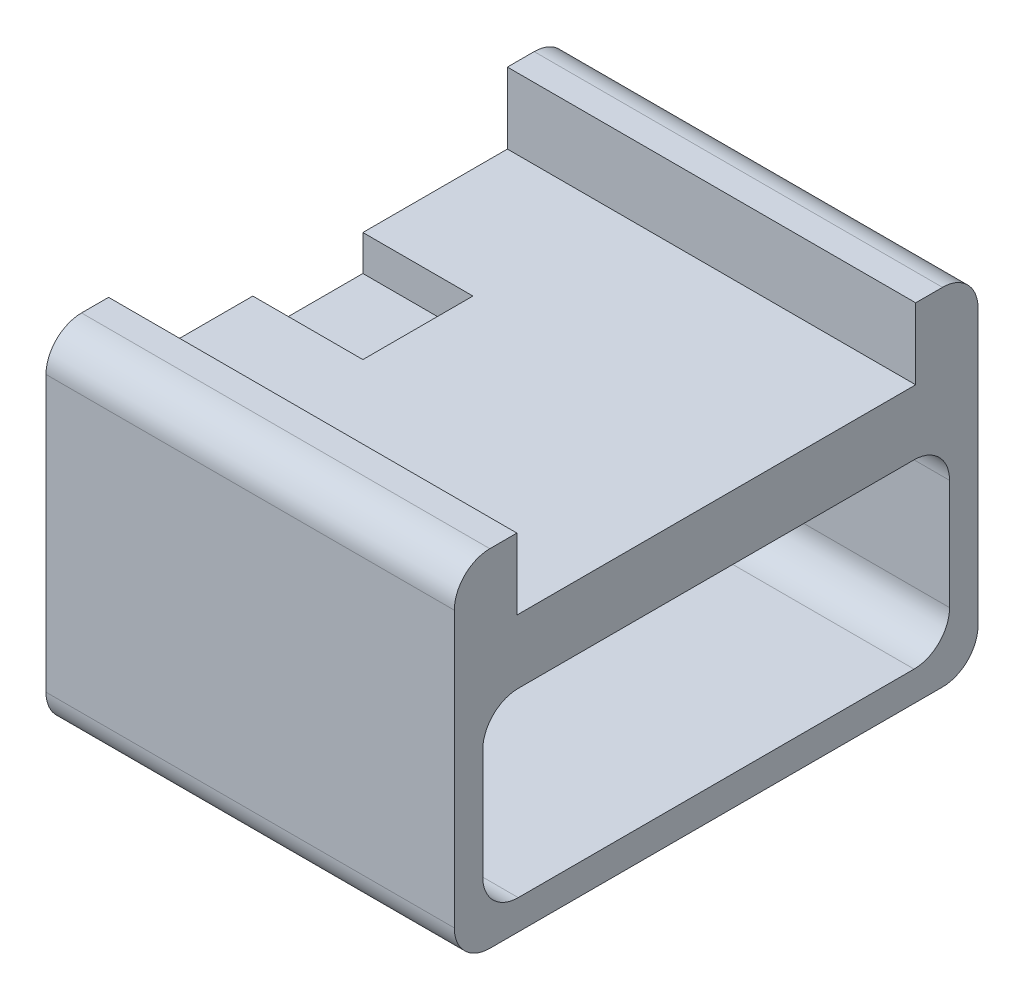
ISO-10303-21;
HEADER;
FILE_DESCRIPTION(('STEP AP214'),'2;1');
FILE_NAME('part.step','',(''),(''),'','','');
FILE_SCHEMA(('AUTOMOTIVE_DESIGN { 1 0 10303 214 1 1 1 1 }'));
ENDSEC;
DATA;
#1=APPLICATION_CONTEXT('core data for automotive mechanical design processes');
#2=APPLICATION_PROTOCOL_DEFINITION('international standard','automotive_design',2000,#1);
#3=PRODUCT_CONTEXT('',#1,'mechanical');
#4=PRODUCT('Part','Part','',(#3));
#5=PRODUCT_RELATED_PRODUCT_CATEGORY('part','',(#4));
#6=PRODUCT_DEFINITION_FORMATION('','',#4);
#7=PRODUCT_DEFINITION_CONTEXT('part definition',#1,'design');
#8=PRODUCT_DEFINITION('design','',#6,#7);
#9=PRODUCT_DEFINITION_SHAPE('','',#8);
#10=(LENGTH_UNIT() NAMED_UNIT(*) SI_UNIT(.MILLI.,.METRE.));
#11=(NAMED_UNIT(*) PLANE_ANGLE_UNIT() SI_UNIT($,.RADIAN.));
#12=(NAMED_UNIT(*) SI_UNIT($,.STERADIAN.) SOLID_ANGLE_UNIT());
#13=UNCERTAINTY_MEASURE_WITH_UNIT(LENGTH_MEASURE(1.E-05),#10,'distance_accuracy_value','');
#14=(GEOMETRIC_REPRESENTATION_CONTEXT(3) GLOBAL_UNCERTAINTY_ASSIGNED_CONTEXT((#13)) GLOBAL_UNIT_ASSIGNED_CONTEXT((#10,
#11,#12)) REPRESENTATION_CONTEXT('',''));
#15=CARTESIAN_POINT('',(0.,0.,0.));
#16=DIRECTION('',(0.,0.,1.));
#17=DIRECTION('',(1.,0.,0.));
#18=AXIS2_PLACEMENT_3D('',#15,#16,#17);
#19=CARTESIAN_POINT('',(23.,9.75,12.75));
#20=DIRECTION('',(0.,-1.,0.));
#21=DIRECTION('',(0.,0.,-1.));
#22=AXIS2_PLACEMENT_3D('',#19,#20,#21);
#23=PLANE('',#22);
#24=DIRECTION('',(0.,0.,1.));
#25=VECTOR('',#24,1.);
#26=CARTESIAN_POINT('',(0.,9.75,12.75));
#27=LINE('',#26,#25);
#28=CARTESIAN_POINT('',(0.,9.75,-12.75));
#29=VERTEX_POINT('',#28);
#30=CARTESIAN_POINT('',(0.,9.75,-11.2400373427258));
#31=VERTEX_POINT('',#30);
#32=EDGE_CURVE('E197',#29,#31,#27,.T.);
#33=ORIENTED_EDGE('',*,*,#32,.T.);
#34=DIRECTION('',(-1.,0.,0.));
#35=VECTOR('',#34,1.);
#36=CARTESIAN_POINT('',(0.,9.75,-11.2400373427258));
#37=LINE('',#36,#35);
#38=CARTESIAN_POINT('',(23.,9.75,-11.2400373427258));
#39=VERTEX_POINT('',#38);
#40=EDGE_CURVE('E317',#39,#31,#37,.T.);
#41=ORIENTED_EDGE('',*,*,#40,.F.);
#42=DIRECTION('',(0.,0.,1.));
#43=VECTOR('',#42,1.);
#44=CARTESIAN_POINT('',(23.,9.75,12.75));
#45=LINE('',#44,#43);
#46=CARTESIAN_POINT('',(23.,9.75,-12.75));
#47=VERTEX_POINT('',#46);
#48=EDGE_CURVE('E285',#47,#39,#45,.T.);
#49=ORIENTED_EDGE('',*,*,#48,.F.);
#50=DIRECTION('',(-1.,0.,0.));
#51=VECTOR('',#50,1.);
#52=CARTESIAN_POINT('',(23.,9.75,-12.75));
#53=LINE('',#52,#51);
#54=EDGE_CURVE('E215',#47,#29,#53,.T.);
#55=ORIENTED_EDGE('',*,*,#54,.T.);
#56=EDGE_LOOP('',(#33,#41,#49,#55));
#57=FACE_BOUND('',#56,.T.);
#58=ADVANCED_FACE('F33',(#57),#23,.F.);
#59=CARTESIAN_POINT('',(6.2,3.75,-3.1));
#60=DIRECTION('',(1.,0.,0.));
#61=DIRECTION('',(0.,0.,-1.));
#62=AXIS2_PLACEMENT_3D('',#59,#60,#61);
#63=PLANE('',#62);
#64=DIRECTION('',(0.,0.,1.));
#65=VECTOR('',#64,1.);
#66=CARTESIAN_POINT('',(6.2,5.75,-3.1));
#67=LINE('',#66,#65);
#68=CARTESIAN_POINT('',(6.2,5.75,-3.1));
#69=VERTEX_POINT('',#68);
#70=CARTESIAN_POINT('',(6.2,5.75,3.1));
#71=VERTEX_POINT('',#70);
#72=EDGE_CURVE('E333',#69,#71,#67,.T.);
#73=ORIENTED_EDGE('',*,*,#72,.F.);
#74=DIRECTION('',(0.,1.,0.));
#75=VECTOR('',#74,1.);
#76=CARTESIAN_POINT('',(6.2,3.75,-3.1));
#77=LINE('',#76,#75);
#78=CARTESIAN_POINT('',(6.2,3.75,-3.1));
#79=VERTEX_POINT('',#78);
#80=EDGE_CURVE('E98',#79,#69,#77,.T.);
#81=ORIENTED_EDGE('',*,*,#80,.F.);
#82=DIRECTION('',(0.,0.,-1.));
#83=VECTOR('',#82,1.);
#84=CARTESIAN_POINT('',(6.2,3.75,-3.1));
#85=LINE('',#84,#83);
#86=CARTESIAN_POINT('',(6.2,3.75,3.1));
#87=VERTEX_POINT('',#86);
#88=EDGE_CURVE('E262',#87,#79,#85,.T.);
#89=ORIENTED_EDGE('',*,*,#88,.F.);
#90=DIRECTION('',(0.,1.,0.));
#91=VECTOR('',#90,1.);
#92=CARTESIAN_POINT('',(6.2,3.75,3.1));
#93=LINE('',#92,#91);
#94=EDGE_CURVE('E185',#87,#71,#93,.T.);
#95=ORIENTED_EDGE('',*,*,#94,.T.);
#96=EDGE_LOOP('',(#73,#81,#89,#95));
#97=FACE_BOUND('',#96,.T.);
#98=ADVANCED_FACE('F459',(#97),#63,.F.);
#99=CARTESIAN_POINT('',(6.2,3.75,3.1));
#100=DIRECTION('',(0.,0.,1.));
#101=DIRECTION('',(1.,0.,0.));
#102=AXIS2_PLACEMENT_3D('',#99,#100,#101);
#103=PLANE('',#102);
#104=DIRECTION('',(-1.,0.,0.));
#105=VECTOR('',#104,1.);
#106=CARTESIAN_POINT('',(6.2,5.75,3.1));
#107=LINE('',#106,#105);
#108=CARTESIAN_POINT('',(0.,5.75,3.1));
#109=VERTEX_POINT('',#108);
#110=EDGE_CURVE('E340',#71,#109,#107,.T.);
#111=ORIENTED_EDGE('',*,*,#110,.F.);
#112=ORIENTED_EDGE('',*,*,#94,.F.);
#113=DIRECTION('',(1.,0.,0.));
#114=VECTOR('',#113,1.);
#115=CARTESIAN_POINT('',(6.2,3.75,3.1));
#116=LINE('',#115,#114);
#117=CARTESIAN_POINT('',(0.,3.75,3.1));
#118=VERTEX_POINT('',#117);
#119=EDGE_CURVE('E270',#118,#87,#116,.T.);
#120=ORIENTED_EDGE('',*,*,#119,.F.);
#121=DIRECTION('',(0.,1.,0.));
#122=VECTOR('',#121,1.);
#123=CARTESIAN_POINT('',(0.,3.75,3.1));
#124=LINE('',#123,#122);
#125=EDGE_CURVE('E190',#118,#109,#124,.T.);
#126=ORIENTED_EDGE('',*,*,#125,.T.);
#127=EDGE_LOOP('',(#111,#112,#120,#126));
#128=FACE_BOUND('',#127,.T.);
#129=ADVANCED_FACE('F461',(#128),#103,.F.);
#130=CARTESIAN_POINT('',(6.2,3.75,-3.1));
#131=DIRECTION('',(0.,0.,-1.));
#132=DIRECTION('',(-1.,0.,0.));
#133=AXIS2_PLACEMENT_3D('',#130,#131,#132);
#134=PLANE('',#133);
#135=DIRECTION('',(1.,0.,0.));
#136=VECTOR('',#135,1.);
#137=CARTESIAN_POINT('',(6.2,5.75,-3.1));
#138=LINE('',#137,#136);
#139=CARTESIAN_POINT('',(0.,5.75,-3.1));
#140=VERTEX_POINT('',#139);
#141=EDGE_CURVE('E11',#140,#69,#138,.T.);
#142=ORIENTED_EDGE('',*,*,#141,.F.);
#143=DIRECTION('',(0.,1.,0.));
#144=VECTOR('',#143,1.);
#145=CARTESIAN_POINT('',(0.,3.75,-3.1));
#146=LINE('',#145,#144);
#147=CARTESIAN_POINT('',(0.,3.75,-3.1));
#148=VERTEX_POINT('',#147);
#149=EDGE_CURVE('E275',#148,#140,#146,.T.);
#150=ORIENTED_EDGE('',*,*,#149,.F.);
#151=DIRECTION('',(-1.,0.,0.));
#152=VECTOR('',#151,1.);
#153=CARTESIAN_POINT('',(6.2,3.75,-3.1));
#154=LINE('',#153,#152);
#155=EDGE_CURVE('E265',#79,#148,#154,.T.);
#156=ORIENTED_EDGE('',*,*,#155,.F.);
#157=ORIENTED_EDGE('',*,*,#80,.T.);
#158=EDGE_LOOP('',(#142,#150,#156,#157));
#159=FACE_BOUND('',#158,.T.);
#160=ADVANCED_FACE('F455',(#159),#134,.F.);
#161=CARTESIAN_POINT('',(23.,-7.75,-12.75));
#162=DIRECTION('',(-1.,0.,0.));
#163=DIRECTION('',(0.,0.,1.));
#164=AXIS2_PLACEMENT_3D('',#161,#162,#163);
#165=CYLINDRICAL_SURFACE('',#164,2.);
#166=CARTESIAN_POINT('',(0.,-7.75,-12.75));
#167=DIRECTION('',(1.,0.,0.));
#168=DIRECTION('',(0.,0.,1.));
#169=AXIS2_PLACEMENT_3D('',#166,#167,#168);
#170=CIRCLE('',#169,2.);
#171=CARTESIAN_POINT('',(0.,-9.75,-12.75));
#172=VERTEX_POINT('',#171);
#173=CARTESIAN_POINT('',(0.,-7.75,-14.75));
#174=VERTEX_POINT('',#173);
#175=EDGE_CURVE('E175',#172,#174,#170,.T.);
#176=ORIENTED_EDGE('',*,*,#175,.T.);
#177=DIRECTION('',(-1.,0.,0.));
#178=VECTOR('',#177,1.);
#179=CARTESIAN_POINT('',(23.,-7.75,-14.75));
#180=LINE('',#179,#178);
#181=CARTESIAN_POINT('',(23.,-7.75,-14.75));
#182=VERTEX_POINT('',#181);
#183=EDGE_CURVE('E221',#182,#174,#180,.T.);
#184=ORIENTED_EDGE('',*,*,#183,.F.);
#185=CARTESIAN_POINT('',(23.,-7.75,-12.75));
#186=DIRECTION('',(1.,0.,0.));
#187=DIRECTION('',(0.,0.,1.));
#188=AXIS2_PLACEMENT_3D('',#185,#186,#187);
#189=CIRCLE('',#188,2.);
#190=CARTESIAN_POINT('',(23.,-9.75,-12.75));
#191=VERTEX_POINT('',#190);
#192=EDGE_CURVE('E169',#191,#182,#189,.T.);
#193=ORIENTED_EDGE('',*,*,#192,.F.);
#194=DIRECTION('',(-1.,0.,0.));
#195=VECTOR('',#194,1.);
#196=CARTESIAN_POINT('',(23.,-9.75,-12.75));
#197=LINE('',#196,#195);
#198=EDGE_CURVE('E162',#191,#172,#197,.T.);
#199=ORIENTED_EDGE('',*,*,#198,.T.);
#200=EDGE_LOOP('',(#176,#184,#193,#199));
#201=FACE_BOUND('',#200,.T.);
#202=ADVANCED_FACE('F35',(#201),#165,.T.);
#203=CARTESIAN_POINT('',(23.,-7.75,-14.75));
#204=DIRECTION('',(0.,0.,1.));
#205=DIRECTION('',(0.,-1.,0.));
#206=AXIS2_PLACEMENT_3D('',#203,#204,#205);
#207=PLANE('',#206);
#208=DIRECTION('',(0.,1.,0.));
#209=VECTOR('',#208,1.);
#210=CARTESIAN_POINT('',(0.,-7.75,-14.75));
#211=LINE('',#210,#209);
#212=CARTESIAN_POINT('',(0.,7.75,-14.75));
#213=VERTEX_POINT('',#212);
#214=EDGE_CURVE('E183',#174,#213,#211,.T.);
#215=ORIENTED_EDGE('',*,*,#214,.T.);
#216=DIRECTION('',(-1.,0.,0.));
#217=VECTOR('',#216,1.);
#218=CARTESIAN_POINT('',(23.,7.75,-14.75));
#219=LINE('',#218,#217);
#220=CARTESIAN_POINT('',(23.,7.75,-14.75));
#221=VERTEX_POINT('',#220);
#222=EDGE_CURVE('E218',#221,#213,#219,.T.);
#223=ORIENTED_EDGE('',*,*,#222,.F.);
#224=DIRECTION('',(0.,1.,0.));
#225=VECTOR('',#224,1.);
#226=CARTESIAN_POINT('',(23.,-7.75,-14.75));
#227=LINE('',#226,#225);
#228=EDGE_CURVE('E280',#182,#221,#227,.T.);
#229=ORIENTED_EDGE('',*,*,#228,.F.);
#230=ORIENTED_EDGE('',*,*,#183,.T.);
#231=EDGE_LOOP('',(#215,#223,#229,#230));
#232=FACE_BOUND('',#231,.T.);
#233=ADVANCED_FACE('F298',(#232),#207,.F.);
#234=CARTESIAN_POINT('',(23.,7.75,-12.75));
#235=DIRECTION('',(-1.,0.,0.));
#236=DIRECTION('',(0.,0.,1.));
#237=AXIS2_PLACEMENT_3D('',#234,#235,#236);
#238=CYLINDRICAL_SURFACE('',#237,2.);
#239=CARTESIAN_POINT('',(0.,7.75,-12.75));
#240=DIRECTION('',(1.,0.,0.));
#241=DIRECTION('',(0.,0.,1.));
#242=AXIS2_PLACEMENT_3D('',#239,#240,#241);
#243=CIRCLE('',#242,2.);
#244=EDGE_CURVE('E187',#213,#29,#243,.T.);
#245=ORIENTED_EDGE('',*,*,#244,.T.);
#246=ORIENTED_EDGE('',*,*,#54,.F.);
#247=CARTESIAN_POINT('',(23.,7.75,-12.75));
#248=DIRECTION('',(1.,0.,0.));
#249=DIRECTION('',(0.,0.,1.));
#250=AXIS2_PLACEMENT_3D('',#247,#248,#249);
#251=CIRCLE('',#250,2.);
#252=EDGE_CURVE('E282',#221,#47,#251,.T.);
#253=ORIENTED_EDGE('',*,*,#252,.F.);
#254=ORIENTED_EDGE('',*,*,#222,.T.);
#255=EDGE_LOOP('',(#245,#246,#253,#254));
#256=FACE_BOUND('',#255,.T.);
#257=ADVANCED_FACE('F302',(#256),#238,.T.);
#258=CARTESIAN_POINT('',(23.,9.75,11.2248067322085));
#259=VERTEX_POINT('',#258);
#260=CARTESIAN_POINT('',(23.,9.75,12.75));
#261=VERTEX_POINT('',#260);
#262=EDGE_CURVE('E284',#259,#261,#45,.T.);
#263=ORIENTED_EDGE('',*,*,#262,.F.);
#264=DIRECTION('',(1.,0.,0.));
#265=VECTOR('',#264,1.);
#266=CARTESIAN_POINT('',(0.,9.75,11.2248067322085));
#267=LINE('',#266,#265);
#268=CARTESIAN_POINT('',(0.,9.75,11.2248067322085));
#269=VERTEX_POINT('',#268);
#270=EDGE_CURVE('E323',#269,#259,#267,.T.);
#271=ORIENTED_EDGE('',*,*,#270,.F.);
#272=CARTESIAN_POINT('',(0.,9.75,12.75));
#273=VERTEX_POINT('',#272);
#274=EDGE_CURVE('E196',#269,#273,#27,.T.);
#275=ORIENTED_EDGE('',*,*,#274,.T.);
#276=DIRECTION('',(-1.,0.,0.));
#277=VECTOR('',#276,1.);
#278=CARTESIAN_POINT('',(23.,9.75,12.75));
#279=LINE('',#278,#277);
#280=EDGE_CURVE('E212',#261,#273,#279,.T.);
#281=ORIENTED_EDGE('',*,*,#280,.F.);
#282=EDGE_LOOP('',(#263,#271,#275,#281));
#283=FACE_BOUND('',#282,.T.);
#284=ADVANCED_FACE('F443',(#283),#23,.F.);
#285=CARTESIAN_POINT('',(23.,7.75,12.75));
#286=DIRECTION('',(-1.,0.,0.));
#287=DIRECTION('',(0.,0.,1.));
#288=AXIS2_PLACEMENT_3D('',#285,#286,#287);
#289=CYLINDRICAL_SURFACE('',#288,2.);
#290=CARTESIAN_POINT('',(0.,7.75,12.75));
#291=DIRECTION('',(1.,0.,0.));
#292=DIRECTION('',(0.,0.,-1.));
#293=AXIS2_PLACEMENT_3D('',#290,#291,#292);
#294=CIRCLE('',#293,2.);
#295=CARTESIAN_POINT('',(0.,7.75,14.75));
#296=VERTEX_POINT('',#295);
#297=EDGE_CURVE('E200',#273,#296,#294,.T.);
#298=ORIENTED_EDGE('',*,*,#297,.T.);
#299=DIRECTION('',(-1.,0.,0.));
#300=VECTOR('',#299,1.);
#301=CARTESIAN_POINT('',(23.,7.75,14.75));
#302=LINE('',#301,#300);
#303=CARTESIAN_POINT('',(23.,7.75,14.75));
#304=VERTEX_POINT('',#303);
#305=EDGE_CURVE('E209',#304,#296,#302,.T.);
#306=ORIENTED_EDGE('',*,*,#305,.F.);
#307=CARTESIAN_POINT('',(23.,7.75,12.75));
#308=DIRECTION('',(1.,0.,0.));
#309=DIRECTION('',(0.,0.,-1.));
#310=AXIS2_PLACEMENT_3D('',#307,#308,#309);
#311=CIRCLE('',#310,2.);
#312=EDGE_CURVE('E288',#261,#304,#311,.T.);
#313=ORIENTED_EDGE('',*,*,#312,.F.);
#314=ORIENTED_EDGE('',*,*,#280,.T.);
#315=EDGE_LOOP('',(#298,#306,#313,#314));
#316=FACE_BOUND('',#315,.T.);
#317=ADVANCED_FACE('F446',(#316),#289,.T.);
#318=CARTESIAN_POINT('',(23.,-7.75,14.75));
#319=DIRECTION('',(0.,0.,-1.));
#320=DIRECTION('',(-1.,0.,0.));
#321=AXIS2_PLACEMENT_3D('',#318,#319,#320);
#322=PLANE('',#321);
#323=DIRECTION('',(0.,-1.,0.));
#324=VECTOR('',#323,1.);
#325=CARTESIAN_POINT('',(0.,-7.75,14.75));
#326=LINE('',#325,#324);
#327=CARTESIAN_POINT('',(0.,-7.75,14.75));
#328=VERTEX_POINT('',#327);
#329=EDGE_CURVE('E202',#296,#328,#326,.T.);
#330=ORIENTED_EDGE('',*,*,#329,.T.);
#331=DIRECTION('',(-1.,0.,0.));
#332=VECTOR('',#331,1.);
#333=CARTESIAN_POINT('',(23.,-7.75,14.75));
#334=LINE('',#333,#332);
#335=CARTESIAN_POINT('',(23.,-7.75,14.75));
#336=VERTEX_POINT('',#335);
#337=EDGE_CURVE('E206',#336,#328,#334,.T.);
#338=ORIENTED_EDGE('',*,*,#337,.F.);
#339=DIRECTION('',(0.,-1.,0.));
#340=VECTOR('',#339,1.);
#341=CARTESIAN_POINT('',(23.,-7.75,14.75));
#342=LINE('',#341,#340);
#343=EDGE_CURVE('E290',#304,#336,#342,.T.);
#344=ORIENTED_EDGE('',*,*,#343,.F.);
#345=ORIENTED_EDGE('',*,*,#305,.T.);
#346=EDGE_LOOP('',(#330,#338,#344,#345));
#347=FACE_BOUND('',#346,.T.);
#348=ADVANCED_FACE('F482',(#347),#322,.F.);
#349=CARTESIAN_POINT('',(23.,-7.75,12.75));
#350=DIRECTION('',(-1.,0.,0.));
#351=DIRECTION('',(0.,0.,1.));
#352=AXIS2_PLACEMENT_3D('',#349,#350,#351);
#353=CYLINDRICAL_SURFACE('',#352,2.);
#354=CARTESIAN_POINT('',(0.,-7.75,12.75));
#355=DIRECTION('',(1.,0.,0.));
#356=DIRECTION('',(0.,0.,-1.));
#357=AXIS2_PLACEMENT_3D('',#354,#355,#356);
#358=CIRCLE('',#357,2.);
#359=CARTESIAN_POINT('',(0.,-9.75,12.75));
#360=VERTEX_POINT('',#359);
#361=EDGE_CURVE('E170',#328,#360,#358,.T.);
#362=ORIENTED_EDGE('',*,*,#361,.T.);
#363=DIRECTION('',(-1.,0.,0.));
#364=VECTOR('',#363,1.);
#365=CARTESIAN_POINT('',(23.,-9.75,12.75));
#366=LINE('',#365,#364);
#367=CARTESIAN_POINT('',(23.,-9.75,12.75));
#368=VERTEX_POINT('',#367);
#369=EDGE_CURVE('E165',#368,#360,#366,.T.);
#370=ORIENTED_EDGE('',*,*,#369,.F.);
#371=CARTESIAN_POINT('',(23.,-7.75,12.75));
#372=DIRECTION('',(1.,0.,0.));
#373=DIRECTION('',(0.,0.,-1.));
#374=AXIS2_PLACEMENT_3D('',#371,#372,#373);
#375=CIRCLE('',#374,2.);
#376=EDGE_CURVE('E291',#336,#368,#375,.T.);
#377=ORIENTED_EDGE('',*,*,#376,.F.);
#378=ORIENTED_EDGE('',*,*,#337,.T.);
#379=EDGE_LOOP('',(#362,#370,#377,#378));
#380=FACE_BOUND('',#379,.T.);
#381=ADVANCED_FACE('F636',(#380),#353,.T.);
#382=CARTESIAN_POINT('',(23.,-9.75,12.75));
#383=DIRECTION('',(0.,1.,0.));
#384=DIRECTION('',(0.,0.,1.));
#385=AXIS2_PLACEMENT_3D('',#382,#383,#384);
#386=PLANE('',#385);
#387=DIRECTION('',(0.,0.,-1.));
#388=VECTOR('',#387,1.);
#389=CARTESIAN_POINT('',(0.,-9.75,12.75));
#390=LINE('',#389,#388);
#391=EDGE_CURVE('E158',#360,#172,#390,.T.);
#392=ORIENTED_EDGE('',*,*,#391,.T.);
#393=ORIENTED_EDGE('',*,*,#198,.F.);
#394=DIRECTION('',(0.,0.,-1.));
#395=VECTOR('',#394,1.);
#396=CARTESIAN_POINT('',(23.,-9.75,12.75));
#397=LINE('',#396,#395);
#398=EDGE_CURVE('E177',#368,#191,#397,.T.);
#399=ORIENTED_EDGE('',*,*,#398,.F.);
#400=ORIENTED_EDGE('',*,*,#369,.T.);
#401=EDGE_LOOP('',(#392,#393,#399,#400));
#402=FACE_BOUND('',#401,.T.);
#403=ADVANCED_FACE('F160',(#402),#386,.F.);
#404=CARTESIAN_POINT('',(23.,-7.75,-12.75));
#405=DIRECTION('',(-1.,0.,0.));
#406=DIRECTION('',(0.,0.,1.));
#407=AXIS2_PLACEMENT_3D('',#404,#405,#406);
#408=PLANE('',#407);
#409=ORIENTED_EDGE('',*,*,#48,.T.);
#410=DIRECTION('',(0.,-1.,0.));
#411=VECTOR('',#410,1.);
#412=CARTESIAN_POINT('',(23.,-7.75,-11.2400373427258));
#413=LINE('',#412,#411);
#414=CARTESIAN_POINT('',(23.,5.75,-11.2400373427258));
#415=VERTEX_POINT('',#414);
#416=EDGE_CURVE('E309',#39,#415,#413,.T.);
#417=ORIENTED_EDGE('',*,*,#416,.T.);
#418=DIRECTION('',(0.,0.,-1.));
#419=VECTOR('',#418,1.);
#420=CARTESIAN_POINT('',(23.,5.75,-12.75));
#421=LINE('',#420,#419);
#422=CARTESIAN_POINT('',(23.,5.75,11.2248067322085));
#423=VERTEX_POINT('',#422);
#424=EDGE_CURVE('E343',#423,#415,#421,.T.);
#425=ORIENTED_EDGE('',*,*,#424,.F.);
#426=DIRECTION('',(0.,1.,0.));
#427=VECTOR('',#426,1.);
#428=CARTESIAN_POINT('',(23.,-7.75,11.2248067322085));
#429=LINE('',#428,#427);
#430=EDGE_CURVE('E346',#423,#259,#429,.T.);
#431=ORIENTED_EDGE('',*,*,#430,.T.);
#432=ORIENTED_EDGE('',*,*,#262,.T.);
#433=ORIENTED_EDGE('',*,*,#312,.T.);
#434=ORIENTED_EDGE('',*,*,#343,.T.);
#435=ORIENTED_EDGE('',*,*,#376,.T.);
#436=ORIENTED_EDGE('',*,*,#398,.T.);
#437=ORIENTED_EDGE('',*,*,#192,.T.);
#438=ORIENTED_EDGE('',*,*,#228,.T.);
#439=ORIENTED_EDGE('',*,*,#252,.T.);
#440=EDGE_LOOP('',(#409,#417,#425,#431,#432,#433,#434,#435,#436,#437,#438,#439));
#441=FACE_BOUND('',#440,.T.);
#442=DIRECTION('',(0.,0.,1.));
#443=VECTOR('',#442,1.);
#444=CARTESIAN_POINT('',(23.,-8.07292875406995,-11.147623692795));
#445=LINE('',#444,#443);
#446=CARTESIAN_POINT('',(23.,-8.07292875406995,-11.147623692795));
#447=VERTEX_POINT('',#446);
#448=CARTESIAN_POINT('',(23.,-8.07292875406995,11.147623692795));
#449=VERTEX_POINT('',#448);
#450=EDGE_CURVE('E258',#447,#449,#445,.T.);
#451=ORIENTED_EDGE('',*,*,#450,.T.);
#452=CARTESIAN_POINT('',(23.,-6.07292875406995,11.147623692795));
#453=DIRECTION('',(-1.,0.,0.));
#454=DIRECTION('',(0.,0.,1.));
#455=AXIS2_PLACEMENT_3D('',#452,#453,#454);
#456=CIRCLE('',#455,2.);
#457=CARTESIAN_POINT('',(23.,-6.07292875406995,13.147623692795));
#458=VERTEX_POINT('',#457);
#459=EDGE_CURVE('E350',#449,#458,#456,.T.);
#460=ORIENTED_EDGE('',*,*,#459,.T.);
#461=DIRECTION('',(0.,1.,0.));
#462=VECTOR('',#461,1.);
#463=CARTESIAN_POINT('',(23.,-6.07292875406995,13.147623692795));
#464=LINE('',#463,#462);
#465=CARTESIAN_POINT('',(23.,0.135263403800991,13.147623692795));
#466=VERTEX_POINT('',#465);
#467=EDGE_CURVE('E353',#458,#466,#464,.T.);
#468=ORIENTED_EDGE('',*,*,#467,.T.);
#469=CARTESIAN_POINT('',(23.,0.135263403800991,11.147623692795));
#470=DIRECTION('',(-1.,0.,0.));
#471=DIRECTION('',(0.,0.,-1.));
#472=AXIS2_PLACEMENT_3D('',#469,#470,#471);
#473=CIRCLE('',#472,2.);
#474=CARTESIAN_POINT('',(23.,2.13526340380099,11.147623692795));
#475=VERTEX_POINT('',#474);
#476=EDGE_CURVE('E56',#466,#475,#473,.T.);
#477=ORIENTED_EDGE('',*,*,#476,.T.);
#478=DIRECTION('',(0.,0.,-1.));
#479=VECTOR('',#478,1.);
#480=CARTESIAN_POINT('',(23.,2.13526340380099,-11.147623692795));
#481=LINE('',#480,#479);
#482=CARTESIAN_POINT('',(23.,2.13526340380099,-11.147623692795));
#483=VERTEX_POINT('',#482);
#484=EDGE_CURVE('E356',#475,#483,#481,.T.);
#485=ORIENTED_EDGE('',*,*,#484,.T.);
#486=CARTESIAN_POINT('',(23.,0.135263403800991,-11.147623692795));
#487=DIRECTION('',(-1.,0.,0.));
#488=DIRECTION('',(0.,0.,-1.));
#489=AXIS2_PLACEMENT_3D('',#486,#487,#488);
#490=CIRCLE('',#489,2.);
#491=CARTESIAN_POINT('',(23.,0.135263403800991,-13.147623692795));
#492=VERTEX_POINT('',#491);
#493=EDGE_CURVE('E359',#483,#492,#490,.T.);
#494=ORIENTED_EDGE('',*,*,#493,.T.);
#495=DIRECTION('',(0.,-1.,0.));
#496=VECTOR('',#495,1.);
#497=CARTESIAN_POINT('',(23.,-6.07292875406995,-13.147623692795));
#498=LINE('',#497,#496);
#499=CARTESIAN_POINT('',(23.,-6.07292875406995,-13.147623692795));
#500=VERTEX_POINT('',#499);
#501=EDGE_CURVE('E362',#492,#500,#498,.T.);
#502=ORIENTED_EDGE('',*,*,#501,.T.);
#503=CARTESIAN_POINT('',(23.,-6.07292875406995,-11.147623692795));
#504=DIRECTION('',(-1.,0.,0.));
#505=DIRECTION('',(0.,0.,1.));
#506=AXIS2_PLACEMENT_3D('',#503,#504,#505);
#507=CIRCLE('',#506,2.);
#508=EDGE_CURVE('E365',#500,#447,#507,.T.);
#509=ORIENTED_EDGE('',*,*,#508,.T.);
#510=EDGE_LOOP('',(#451,#460,#468,#477,#485,#494,#502,#509));
#511=FACE_BOUND('',#510,.T.);
#512=ADVANCED_FACE('F294',(#441,#511),#408,.F.);
#513=CARTESIAN_POINT('',(0.,-7.75,-12.75));
#514=DIRECTION('',(-1.,0.,0.));
#515=DIRECTION('',(0.,0.,1.));
#516=AXIS2_PLACEMENT_3D('',#513,#514,#515);
#517=PLANE('',#516);
#518=DIRECTION('',(0.,1.,0.));
#519=VECTOR('',#518,1.);
#520=CARTESIAN_POINT('',(0.,5.75,11.2248067322085));
#521=LINE('',#520,#519);
#522=CARTESIAN_POINT('',(0.,5.75,11.2248067322085));
#523=VERTEX_POINT('',#522);
#524=EDGE_CURVE('E334',#523,#269,#521,.T.);
#525=ORIENTED_EDGE('',*,*,#524,.F.);
#526=DIRECTION('',(0.,0.,1.));
#527=VECTOR('',#526,1.);
#528=CARTESIAN_POINT('',(0.,5.75,-11.2400373427258));
#529=LINE('',#528,#527);
#530=EDGE_CURVE('E322',#109,#523,#529,.T.);
#531=ORIENTED_EDGE('',*,*,#530,.F.);
#532=ORIENTED_EDGE('',*,*,#125,.F.);
#533=DIRECTION('',(0.,0.,1.));
#534=VECTOR('',#533,1.);
#535=CARTESIAN_POINT('',(0.,3.75,-3.1));
#536=LINE('',#535,#534);
#537=EDGE_CURVE('E268',#148,#118,#536,.T.);
#538=ORIENTED_EDGE('',*,*,#537,.F.);
#539=ORIENTED_EDGE('',*,*,#149,.T.);
#540=CARTESIAN_POINT('',(0.,5.75,-11.2400373427258));
#541=VERTEX_POINT('',#540);
#542=EDGE_CURVE('E47',#541,#140,#529,.T.);
#543=ORIENTED_EDGE('',*,*,#542,.F.);
#544=DIRECTION('',(0.,1.,0.));
#545=VECTOR('',#544,1.);
#546=CARTESIAN_POINT('',(0.,5.75,-11.2400373427258));
#547=LINE('',#546,#545);
#548=EDGE_CURVE('E331',#541,#31,#547,.T.);
#549=ORIENTED_EDGE('',*,*,#548,.T.);
#550=ORIENTED_EDGE('',*,*,#32,.F.);
#551=ORIENTED_EDGE('',*,*,#244,.F.);
#552=ORIENTED_EDGE('',*,*,#214,.F.);
#553=ORIENTED_EDGE('',*,*,#175,.F.);
#554=ORIENTED_EDGE('',*,*,#391,.F.);
#555=ORIENTED_EDGE('',*,*,#361,.F.);
#556=ORIENTED_EDGE('',*,*,#329,.F.);
#557=ORIENTED_EDGE('',*,*,#297,.F.);
#558=ORIENTED_EDGE('',*,*,#274,.F.);
#559=EDGE_LOOP('',(#525,#531,#532,#538,#539,#543,#549,#550,#551,#552,#553,#554,#555,#556,#557,#558));
#560=FACE_BOUND('',#559,.T.);
#561=CARTESIAN_POINT('',(0.,-6.07292875406995,11.147623692795));
#562=DIRECTION('',(-1.,0.,0.));
#563=DIRECTION('',(0.,0.,1.));
#564=AXIS2_PLACEMENT_3D('',#561,#562,#563);
#565=CIRCLE('',#564,2.);
#566=CARTESIAN_POINT('',(0.,-8.07292875406995,11.147623692795));
#567=VERTEX_POINT('',#566);
#568=CARTESIAN_POINT('',(0.,-6.07292875406995,13.147623692795));
#569=VERTEX_POINT('',#568);
#570=EDGE_CURVE('E41',#567,#569,#565,.T.);
#571=ORIENTED_EDGE('',*,*,#570,.F.);
#572=DIRECTION('',(0.,0.,-1.));
#573=VECTOR('',#572,1.);
#574=CARTESIAN_POINT('',(0.,-8.07292875406995,-11.147623692795));
#575=LINE('',#574,#573);
#576=CARTESIAN_POINT('',(0.,-8.07292875406995,-11.147623692795));
#577=VERTEX_POINT('',#576);
#578=EDGE_CURVE('E89',#577,#567,#575,.F.);
#579=ORIENTED_EDGE('',*,*,#578,.F.);
#580=CARTESIAN_POINT('',(0.,-6.07292875406995,-11.147623692795));
#581=DIRECTION('',(-1.,0.,0.));
#582=DIRECTION('',(0.,0.,1.));
#583=AXIS2_PLACEMENT_3D('',#580,#581,#582);
#584=CIRCLE('',#583,2.);
#585=CARTESIAN_POINT('',(0.,-6.07292875406995,-13.147623692795));
#586=VERTEX_POINT('',#585);
#587=EDGE_CURVE('E233',#586,#577,#584,.T.);
#588=ORIENTED_EDGE('',*,*,#587,.F.);
#589=DIRECTION('',(0.,1.,0.));
#590=VECTOR('',#589,1.);
#591=CARTESIAN_POINT('',(0.,-6.07292875406995,-13.147623692795));
#592=LINE('',#591,#590);
#593=CARTESIAN_POINT('',(0.,0.135263403800991,-13.147623692795));
#594=VERTEX_POINT('',#593);
#595=EDGE_CURVE('E231',#594,#586,#592,.F.);
#596=ORIENTED_EDGE('',*,*,#595,.F.);
#597=CARTESIAN_POINT('',(0.,0.135263403800991,-11.147623692795));
#598=DIRECTION('',(-1.,0.,0.));
#599=DIRECTION('',(0.,0.,1.));
#600=AXIS2_PLACEMENT_3D('',#597,#598,#599);
#601=CIRCLE('',#600,2.);
#602=CARTESIAN_POINT('',(0.,2.13526340380099,-11.147623692795));
#603=VERTEX_POINT('',#602);
#604=EDGE_CURVE('E229',#603,#594,#601,.T.);
#605=ORIENTED_EDGE('',*,*,#604,.F.);
#606=DIRECTION('',(0.,0.,1.));
#607=VECTOR('',#606,1.);
#608=CARTESIAN_POINT('',(0.,2.13526340380099,-11.147623692795));
#609=LINE('',#608,#607);
#610=CARTESIAN_POINT('',(0.,2.13526340380099,11.147623692795));
#611=VERTEX_POINT('',#610);
#612=EDGE_CURVE('E227',#611,#603,#609,.F.);
#613=ORIENTED_EDGE('',*,*,#612,.F.);
#614=CARTESIAN_POINT('',(0.,0.135263403800991,11.147623692795));
#615=DIRECTION('',(-1.,0.,0.));
#616=DIRECTION('',(0.,0.,1.));
#617=AXIS2_PLACEMENT_3D('',#614,#615,#616);
#618=CIRCLE('',#617,2.);
#619=CARTESIAN_POINT('',(0.,0.135263403800991,13.147623692795));
#620=VERTEX_POINT('',#619);
#621=EDGE_CURVE('E225',#620,#611,#618,.T.);
#622=ORIENTED_EDGE('',*,*,#621,.F.);
#623=DIRECTION('',(0.,1.,0.));
#624=VECTOR('',#623,1.);
#625=CARTESIAN_POINT('',(0.,-6.07292875406995,13.147623692795));
#626=LINE('',#625,#624);
#627=EDGE_CURVE('E223',#569,#620,#626,.T.);
#628=ORIENTED_EDGE('',*,*,#627,.F.);
#629=EDGE_LOOP('',(#571,#579,#588,#596,#605,#613,#622,#628));
#630=FACE_BOUND('',#629,.T.);
#631=ADVANCED_FACE('F180',(#560,#630),#517,.T.);
#632=CARTESIAN_POINT('',(0.,3.75,0.));
#633=DIRECTION('',(0.,-1.,0.));
#634=DIRECTION('',(0.,0.,-1.));
#635=AXIS2_PLACEMENT_3D('',#632,#633,#634);
#636=PLANE('',#635);
#637=ORIENTED_EDGE('',*,*,#88,.T.);
#638=ORIENTED_EDGE('',*,*,#155,.T.);
#639=ORIENTED_EDGE('',*,*,#537,.T.);
#640=ORIENTED_EDGE('',*,*,#119,.T.);
#641=EDGE_LOOP('',(#637,#638,#639,#640));
#642=FACE_BOUND('',#641,.T.);
#643=ADVANCED_FACE('F457',(#642),#636,.F.);
#644=CARTESIAN_POINT('',(23.,-6.07292875406995,11.147623692795));
#645=DIRECTION('',(-1.,0.,0.));
#646=DIRECTION('',(0.,0.,1.));
#647=AXIS2_PLACEMENT_3D('',#644,#645,#646);
#648=CYLINDRICAL_SURFACE('',#647,2.);
#649=ORIENTED_EDGE('',*,*,#570,.T.);
#650=DIRECTION('',(-1.,0.,0.));
#651=VECTOR('',#650,1.);
#652=CARTESIAN_POINT('',(23.,-6.07292875406995,13.147623692795));
#653=LINE('',#652,#651);
#654=EDGE_CURVE('E243',#458,#569,#653,.T.);
#655=ORIENTED_EDGE('',*,*,#654,.F.);
#656=ORIENTED_EDGE('',*,*,#459,.F.);
#657=DIRECTION('',(-1.,0.,0.));
#658=VECTOR('',#657,1.);
#659=CARTESIAN_POINT('',(23.,-8.07292875406995,11.147623692795));
#660=LINE('',#659,#658);
#661=EDGE_CURVE('E245',#449,#567,#660,.T.);
#662=ORIENTED_EDGE('',*,*,#661,.T.);
#663=EDGE_LOOP('',(#649,#655,#656,#662));
#664=FACE_BOUND('',#663,.T.);
#665=ADVANCED_FACE('F240',(#664),#648,.F.);
#666=CARTESIAN_POINT('',(23.,-8.07292875406995,-11.147623692795));
#667=DIRECTION('',(0.,-1.,0.));
#668=DIRECTION('',(0.,0.,-1.));
#669=AXIS2_PLACEMENT_3D('',#666,#667,#668);
#670=PLANE('',#669);
#671=ORIENTED_EDGE('',*,*,#578,.T.);
#672=ORIENTED_EDGE('',*,*,#661,.F.);
#673=ORIENTED_EDGE('',*,*,#450,.F.);
#674=DIRECTION('',(-1.,0.,0.));
#675=VECTOR('',#674,1.);
#676=CARTESIAN_POINT('',(23.,-8.07292875406995,-11.147623692795));
#677=LINE('',#676,#675);
#678=EDGE_CURVE('E370',#447,#577,#677,.T.);
#679=ORIENTED_EDGE('',*,*,#678,.T.);
#680=EDGE_LOOP('',(#671,#672,#673,#679));
#681=FACE_BOUND('',#680,.T.);
#682=ADVANCED_FACE('F407',(#681),#670,.F.);
#683=CARTESIAN_POINT('',(23.,-6.07292875406995,-11.147623692795));
#684=DIRECTION('',(-1.,0.,0.));
#685=DIRECTION('',(0.,0.,1.));
#686=AXIS2_PLACEMENT_3D('',#683,#684,#685);
#687=CYLINDRICAL_SURFACE('',#686,2.);
#688=ORIENTED_EDGE('',*,*,#587,.T.);
#689=ORIENTED_EDGE('',*,*,#678,.F.);
#690=ORIENTED_EDGE('',*,*,#508,.F.);
#691=DIRECTION('',(-1.,0.,0.));
#692=VECTOR('',#691,1.);
#693=CARTESIAN_POINT('',(23.,-6.07292875406995,-13.147623692795));
#694=LINE('',#693,#692);
#695=EDGE_CURVE('E372',#500,#586,#694,.T.);
#696=ORIENTED_EDGE('',*,*,#695,.T.);
#697=EDGE_LOOP('',(#688,#689,#690,#696));
#698=FACE_BOUND('',#697,.T.);
#699=ADVANCED_FACE('F397',(#698),#687,.F.);
#700=CARTESIAN_POINT('',(23.,-6.07292875406995,-13.147623692795));
#701=DIRECTION('',(0.,0.,-1.));
#702=DIRECTION('',(-1.,0.,0.));
#703=AXIS2_PLACEMENT_3D('',#700,#701,#702);
#704=PLANE('',#703);
#705=ORIENTED_EDGE('',*,*,#595,.T.);
#706=ORIENTED_EDGE('',*,*,#695,.F.);
#707=ORIENTED_EDGE('',*,*,#501,.F.);
#708=DIRECTION('',(-1.,0.,0.));
#709=VECTOR('',#708,1.);
#710=CARTESIAN_POINT('',(23.,0.135263403800991,-13.147623692795));
#711=LINE('',#710,#709);
#712=EDGE_CURVE('E376',#492,#594,#711,.T.);
#713=ORIENTED_EDGE('',*,*,#712,.T.);
#714=EDGE_LOOP('',(#705,#706,#707,#713));
#715=FACE_BOUND('',#714,.T.);
#716=ADVANCED_FACE('F392',(#715),#704,.F.);
#717=CARTESIAN_POINT('',(23.,0.135263403800991,-11.147623692795));
#718=DIRECTION('',(-1.,0.,0.));
#719=DIRECTION('',(0.,0.,1.));
#720=AXIS2_PLACEMENT_3D('',#717,#718,#719);
#721=CYLINDRICAL_SURFACE('',#720,2.);
#722=ORIENTED_EDGE('',*,*,#604,.T.);
#723=ORIENTED_EDGE('',*,*,#712,.F.);
#724=ORIENTED_EDGE('',*,*,#493,.F.);
#725=DIRECTION('',(-1.,0.,0.));
#726=VECTOR('',#725,1.);
#727=CARTESIAN_POINT('',(23.,2.13526340380099,-11.147623692795));
#728=LINE('',#727,#726);
#729=EDGE_CURVE('E256',#483,#603,#728,.T.);
#730=ORIENTED_EDGE('',*,*,#729,.T.);
#731=EDGE_LOOP('',(#722,#723,#724,#730));
#732=FACE_BOUND('',#731,.T.);
#733=ADVANCED_FACE('F383',(#732),#721,.F.);
#734=CARTESIAN_POINT('',(23.,2.13526340380099,-11.147623692795));
#735=DIRECTION('',(0.,1.,0.));
#736=DIRECTION('',(0.,0.,1.));
#737=AXIS2_PLACEMENT_3D('',#734,#735,#736);
#738=PLANE('',#737);
#739=ORIENTED_EDGE('',*,*,#612,.T.);
#740=ORIENTED_EDGE('',*,*,#729,.F.);
#741=ORIENTED_EDGE('',*,*,#484,.F.);
#742=DIRECTION('',(-1.,0.,0.));
#743=VECTOR('',#742,1.);
#744=CARTESIAN_POINT('',(23.,2.13526340380099,11.147623692795));
#745=LINE('',#744,#743);
#746=EDGE_CURVE('E254',#475,#611,#745,.T.);
#747=ORIENTED_EDGE('',*,*,#746,.T.);
#748=EDGE_LOOP('',(#739,#740,#741,#747));
#749=FACE_BOUND('',#748,.T.);
#750=ADVANCED_FACE('F564',(#749),#738,.F.);
#751=CARTESIAN_POINT('',(23.,0.135263403800991,11.147623692795));
#752=DIRECTION('',(-1.,0.,0.));
#753=DIRECTION('',(0.,0.,1.));
#754=AXIS2_PLACEMENT_3D('',#751,#752,#753);
#755=CYLINDRICAL_SURFACE('',#754,2.);
#756=ORIENTED_EDGE('',*,*,#621,.T.);
#757=ORIENTED_EDGE('',*,*,#746,.F.);
#758=ORIENTED_EDGE('',*,*,#476,.F.);
#759=DIRECTION('',(-1.,0.,0.));
#760=VECTOR('',#759,1.);
#761=CARTESIAN_POINT('',(23.,0.135263403800991,13.147623692795));
#762=LINE('',#761,#760);
#763=EDGE_CURVE('E250',#466,#620,#762,.T.);
#764=ORIENTED_EDGE('',*,*,#763,.T.);
#765=EDGE_LOOP('',(#756,#757,#758,#764));
#766=FACE_BOUND('',#765,.T.);
#767=ADVANCED_FACE('F252',(#766),#755,.F.);
#768=CARTESIAN_POINT('',(23.,-6.07292875406995,13.147623692795));
#769=DIRECTION('',(0.,0.,1.));
#770=DIRECTION('',(1.,0.,0.));
#771=AXIS2_PLACEMENT_3D('',#768,#769,#770);
#772=PLANE('',#771);
#773=ORIENTED_EDGE('',*,*,#627,.T.);
#774=ORIENTED_EDGE('',*,*,#763,.F.);
#775=ORIENTED_EDGE('',*,*,#467,.F.);
#776=ORIENTED_EDGE('',*,*,#654,.T.);
#777=EDGE_LOOP('',(#773,#774,#775,#776));
#778=FACE_BOUND('',#777,.T.);
#779=ADVANCED_FACE('F249',(#778),#772,.F.);
#780=CARTESIAN_POINT('',(0.,5.75,-11.2400373427258));
#781=DIRECTION('',(0.,0.,-1.));
#782=DIRECTION('',(-1.,0.,0.));
#783=AXIS2_PLACEMENT_3D('',#780,#781,#782);
#784=PLANE('',#783);
#785=ORIENTED_EDGE('',*,*,#40,.T.);
#786=ORIENTED_EDGE('',*,*,#548,.F.);
#787=DIRECTION('',(-1.,0.,0.));
#788=VECTOR('',#787,1.);
#789=CARTESIAN_POINT('',(0.,5.75,-11.2400373427258));
#790=LINE('',#789,#788);
#791=EDGE_CURVE('E337',#415,#541,#790,.T.);
#792=ORIENTED_EDGE('',*,*,#791,.F.);
#793=ORIENTED_EDGE('',*,*,#416,.F.);
#794=EDGE_LOOP('',(#785,#786,#792,#793));
#795=FACE_BOUND('',#794,.T.);
#796=ADVANCED_FACE('F451',(#795),#784,.F.);
#797=CARTESIAN_POINT('',(0.,5.75,11.2248067322085));
#798=DIRECTION('',(0.,0.,1.));
#799=DIRECTION('',(0.,-1.,0.));
#800=AXIS2_PLACEMENT_3D('',#797,#798,#799);
#801=PLANE('',#800);
#802=DIRECTION('',(1.,0.,0.));
#803=VECTOR('',#802,1.);
#804=CARTESIAN_POINT('',(0.,5.75,11.2248067322085));
#805=LINE('',#804,#803);
#806=EDGE_CURVE('E430',#523,#423,#805,.T.);
#807=ORIENTED_EDGE('',*,*,#806,.F.);
#808=ORIENTED_EDGE('',*,*,#524,.T.);
#809=ORIENTED_EDGE('',*,*,#270,.T.);
#810=ORIENTED_EDGE('',*,*,#430,.F.);
#811=EDGE_LOOP('',(#807,#808,#809,#810));
#812=FACE_BOUND('',#811,.T.);
#813=ADVANCED_FACE('F434',(#812),#801,.F.);
#814=CARTESIAN_POINT('',(0.,5.75,0.));
#815=DIRECTION('',(0.,1.,0.));
#816=DIRECTION('',(0.,0.,1.));
#817=AXIS2_PLACEMENT_3D('',#814,#815,#816);
#818=PLANE('',#817);
#819=ORIENTED_EDGE('',*,*,#424,.T.);
#820=ORIENTED_EDGE('',*,*,#791,.T.);
#821=ORIENTED_EDGE('',*,*,#542,.T.);
#822=ORIENTED_EDGE('',*,*,#141,.T.);
#823=ORIENTED_EDGE('',*,*,#72,.T.);
#824=ORIENTED_EDGE('',*,*,#110,.T.);
#825=ORIENTED_EDGE('',*,*,#530,.T.);
#826=ORIENTED_EDGE('',*,*,#806,.T.);
#827=EDGE_LOOP('',(#819,#820,#821,#822,#823,#824,#825,#826));
#828=FACE_BOUND('',#827,.T.);
#829=ADVANCED_FACE('F429',(#828),#818,.T.);
#830=CLOSED_SHELL('',(#58,#98,#129,#160,#202,#233,#257,#284,#317,#348,#381,#403,#512,#631,#643,
#665,#682,#699,#716,#733,#750,#767,#779,#796,#813,#829));
#831=MANIFOLD_SOLID_BREP('B2',#830);
#832=ADVANCED_BREP_SHAPE_REPRESENTATION('',(#18,#831),#14);
#833=SHAPE_DEFINITION_REPRESENTATION(#9,#832);
ENDSEC;
END-ISO-10303-21;
